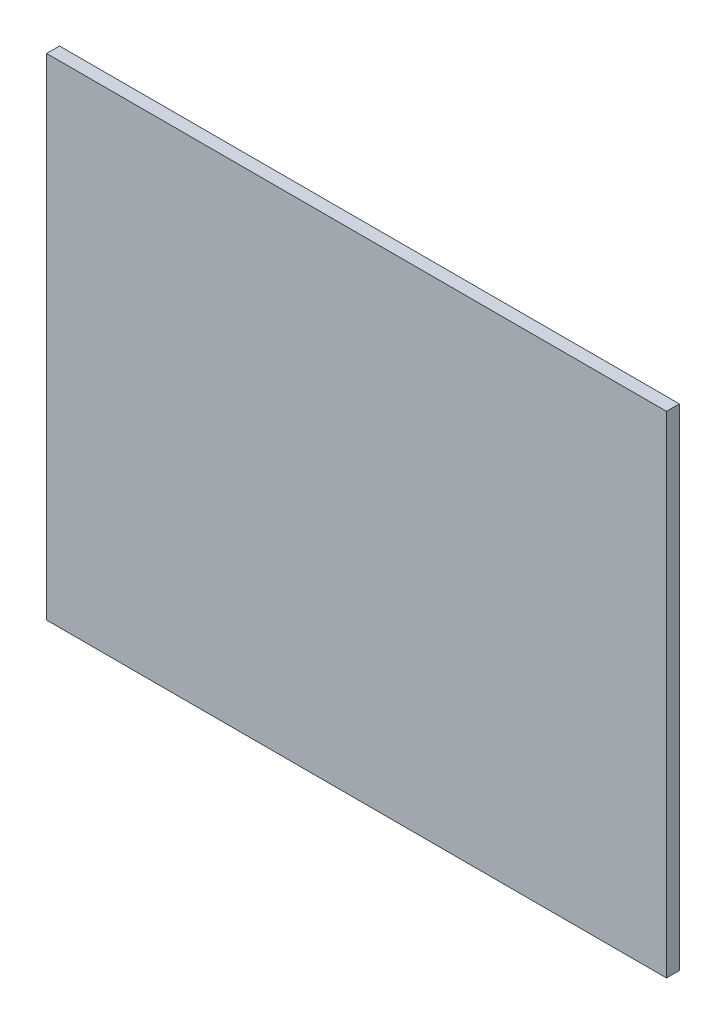
ISO-10303-21;
HEADER;
FILE_DESCRIPTION(('STEP AP214'),'2;1');
FILE_NAME('part.step','',(''),(''),'','','');
FILE_SCHEMA(('AUTOMOTIVE_DESIGN { 1 0 10303 214 1 1 1 1 }'));
ENDSEC;
DATA;
#1=APPLICATION_CONTEXT('core data for automotive mechanical design processes');
#2=APPLICATION_PROTOCOL_DEFINITION('international standard','automotive_design',2000,#1);
#3=PRODUCT_CONTEXT('',#1,'mechanical');
#4=PRODUCT('Part','Part','',(#3));
#5=PRODUCT_RELATED_PRODUCT_CATEGORY('part','',(#4));
#6=PRODUCT_DEFINITION_FORMATION('','',#4);
#7=PRODUCT_DEFINITION_CONTEXT('part definition',#1,'design');
#8=PRODUCT_DEFINITION('design','',#6,#7);
#9=PRODUCT_DEFINITION_SHAPE('','',#8);
#10=(LENGTH_UNIT() NAMED_UNIT(*) SI_UNIT(.MILLI.,.METRE.));
#11=(NAMED_UNIT(*) PLANE_ANGLE_UNIT() SI_UNIT($,.RADIAN.));
#12=(NAMED_UNIT(*) SI_UNIT($,.STERADIAN.) SOLID_ANGLE_UNIT());
#13=UNCERTAINTY_MEASURE_WITH_UNIT(LENGTH_MEASURE(1.E-05),#10,'distance_accuracy_value','');
#14=(GEOMETRIC_REPRESENTATION_CONTEXT(3) GLOBAL_UNCERTAINTY_ASSIGNED_CONTEXT((#13)) GLOBAL_UNIT_ASSIGNED_CONTEXT((#10,
#11,#12)) REPRESENTATION_CONTEXT('',''));
#15=CARTESIAN_POINT('',(0.,0.,0.));
#16=DIRECTION('',(0.,0.,1.));
#17=DIRECTION('',(1.,0.,0.));
#18=AXIS2_PLACEMENT_3D('',#15,#16,#17);
#19=CARTESIAN_POINT('',(0.,0.,5.));
#20=DIRECTION('',(1.,0.,0.));
#21=DIRECTION('',(0.,1.,0.));
#22=AXIS2_PLACEMENT_3D('',#19,#20,#21);
#23=PLANE('',#22);
#24=DIRECTION('',(0.,-1.,0.));
#25=VECTOR('',#24,1.);
#26=CARTESIAN_POINT('',(0.,0.,0.));
#27=LINE('',#26,#25);
#28=CARTESIAN_POINT('',(0.,0.,0.));
#29=VERTEX_POINT('',#28);
#30=CARTESIAN_POINT('',(0.,-190.,0.));
#31=VERTEX_POINT('',#30);
#32=EDGE_CURVE('E96',#29,#31,#27,.T.);
#33=ORIENTED_EDGE('',*,*,#32,.T.);
#34=DIRECTION('',(0.,0.,-1.));
#35=VECTOR('',#34,1.);
#36=CARTESIAN_POINT('',(0.,-190.,5.));
#37=LINE('',#36,#35);
#38=CARTESIAN_POINT('',(0.,-190.,5.));
#39=VERTEX_POINT('',#38);
#40=EDGE_CURVE('E11',#39,#31,#37,.T.);
#41=ORIENTED_EDGE('',*,*,#40,.F.);
#42=DIRECTION('',(0.,-1.,0.));
#43=VECTOR('',#42,1.);
#44=CARTESIAN_POINT('',(0.,0.,5.));
#45=LINE('',#44,#43);
#46=CARTESIAN_POINT('',(0.,0.,5.));
#47=VERTEX_POINT('',#46);
#48=EDGE_CURVE('E84',#47,#39,#45,.T.);
#49=ORIENTED_EDGE('',*,*,#48,.F.);
#50=DIRECTION('',(0.,0.,-1.));
#51=VECTOR('',#50,1.);
#52=CARTESIAN_POINT('',(0.,0.,5.));
#53=LINE('',#52,#51);
#54=EDGE_CURVE('E92',#47,#29,#53,.T.);
#55=ORIENTED_EDGE('',*,*,#54,.T.);
#56=EDGE_LOOP('',(#33,#41,#49,#55));
#57=FACE_BOUND('',#56,.T.);
#58=ADVANCED_FACE('F33',(#57),#23,.F.);
#59=CARTESIAN_POINT('',(0.,-190.,5.));
#60=DIRECTION('',(0.,1.,0.));
#61=DIRECTION('',(0.,0.,1.));
#62=AXIS2_PLACEMENT_3D('',#59,#60,#61);
#63=PLANE('',#62);
#64=DIRECTION('',(1.,0.,0.));
#65=VECTOR('',#64,1.);
#66=CARTESIAN_POINT('',(0.,-190.,0.));
#67=LINE('',#66,#65);
#68=CARTESIAN_POINT('',(240.,-190.,0.));
#69=VERTEX_POINT('',#68);
#70=EDGE_CURVE('E88',#31,#69,#67,.T.);
#71=ORIENTED_EDGE('',*,*,#70,.T.);
#72=DIRECTION('',(0.,0.,-1.));
#73=VECTOR('',#72,1.);
#74=CARTESIAN_POINT('',(240.,-190.,5.));
#75=LINE('',#74,#73);
#76=CARTESIAN_POINT('',(240.,-190.,5.));
#77=VERTEX_POINT('',#76);
#78=EDGE_CURVE('E41',#77,#69,#75,.T.);
#79=ORIENTED_EDGE('',*,*,#78,.F.);
#80=DIRECTION('',(1.,0.,0.));
#81=VECTOR('',#80,1.);
#82=CARTESIAN_POINT('',(0.,-190.,5.));
#83=LINE('',#82,#81);
#84=EDGE_CURVE('E79',#39,#77,#83,.T.);
#85=ORIENTED_EDGE('',*,*,#84,.F.);
#86=ORIENTED_EDGE('',*,*,#40,.T.);
#87=EDGE_LOOP('',(#71,#79,#85,#86));
#88=FACE_BOUND('',#87,.T.);
#89=ADVANCED_FACE('F87',(#88),#63,.F.);
#90=CARTESIAN_POINT('',(240.,0.,5.));
#91=DIRECTION('',(-1.,0.,0.));
#92=DIRECTION('',(0.,-1.,0.));
#93=AXIS2_PLACEMENT_3D('',#90,#91,#92);
#94=PLANE('',#93);
#95=DIRECTION('',(0.,1.,0.));
#96=VECTOR('',#95,1.);
#97=CARTESIAN_POINT('',(240.,0.,0.));
#98=LINE('',#97,#96);
#99=CARTESIAN_POINT('',(240.,0.,0.));
#100=VERTEX_POINT('',#99);
#101=EDGE_CURVE('E66',#69,#100,#98,.T.);
#102=ORIENTED_EDGE('',*,*,#101,.T.);
#103=DIRECTION('',(0.,0.,-1.));
#104=VECTOR('',#103,1.);
#105=CARTESIAN_POINT('',(240.,0.,5.));
#106=LINE('',#105,#104);
#107=CARTESIAN_POINT('',(240.,0.,5.));
#108=VERTEX_POINT('',#107);
#109=EDGE_CURVE('E89',#108,#100,#106,.T.);
#110=ORIENTED_EDGE('',*,*,#109,.F.);
#111=DIRECTION('',(0.,1.,0.));
#112=VECTOR('',#111,1.);
#113=CARTESIAN_POINT('',(240.,0.,5.));
#114=LINE('',#113,#112);
#115=EDGE_CURVE('E82',#77,#108,#114,.T.);
#116=ORIENTED_EDGE('',*,*,#115,.F.);
#117=ORIENTED_EDGE('',*,*,#78,.T.);
#118=EDGE_LOOP('',(#102,#110,#116,#117));
#119=FACE_BOUND('',#118,.T.);
#120=ADVANCED_FACE('F90',(#119),#94,.F.);
#121=CARTESIAN_POINT('',(0.,0.,5.));
#122=DIRECTION('',(0.,-1.,0.));
#123=DIRECTION('',(0.,0.,-1.));
#124=AXIS2_PLACEMENT_3D('',#121,#122,#123);
#125=PLANE('',#124);
#126=DIRECTION('',(-1.,0.,0.));
#127=VECTOR('',#126,1.);
#128=CARTESIAN_POINT('',(0.,0.,0.));
#129=LINE('',#128,#127);
#130=EDGE_CURVE('E72',#100,#29,#129,.T.);
#131=ORIENTED_EDGE('',*,*,#130,.T.);
#132=ORIENTED_EDGE('',*,*,#54,.F.);
#133=DIRECTION('',(-1.,0.,0.));
#134=VECTOR('',#133,1.);
#135=CARTESIAN_POINT('',(0.,0.,5.));
#136=LINE('',#135,#134);
#137=EDGE_CURVE('E49',#108,#47,#136,.T.);
#138=ORIENTED_EDGE('',*,*,#137,.F.);
#139=ORIENTED_EDGE('',*,*,#109,.T.);
#140=EDGE_LOOP('',(#131,#132,#138,#139));
#141=FACE_BOUND('',#140,.T.);
#142=ADVANCED_FACE('F103',(#141),#125,.F.);
#143=CARTESIAN_POINT('',(0.,0.,5.));
#144=DIRECTION('',(0.,0.,1.));
#145=DIRECTION('',(1.,0.,0.));
#146=AXIS2_PLACEMENT_3D('',#143,#144,#145);
#147=PLANE('',#146);
#148=ORIENTED_EDGE('',*,*,#48,.T.);
#149=ORIENTED_EDGE('',*,*,#84,.T.);
#150=ORIENTED_EDGE('',*,*,#115,.T.);
#151=ORIENTED_EDGE('',*,*,#137,.T.);
#152=EDGE_LOOP('',(#148,#149,#150,#151));
#153=FACE_BOUND('',#152,.T.);
#154=ADVANCED_FACE('F80',(#153),#147,.T.);
#155=CARTESIAN_POINT('',(0.,0.,0.));
#156=DIRECTION('',(0.,0.,1.));
#157=DIRECTION('',(1.,0.,0.));
#158=AXIS2_PLACEMENT_3D('',#155,#156,#157);
#159=PLANE('',#158);
#160=ORIENTED_EDGE('',*,*,#32,.F.);
#161=ORIENTED_EDGE('',*,*,#130,.F.);
#162=ORIENTED_EDGE('',*,*,#101,.F.);
#163=ORIENTED_EDGE('',*,*,#70,.F.);
#164=EDGE_LOOP('',(#160,#161,#162,#163));
#165=FACE_BOUND('',#164,.T.);
#166=ADVANCED_FACE('F106',(#165),#159,.F.);
#167=CLOSED_SHELL('',(#58,#89,#120,#142,#154,#166));
#168=MANIFOLD_SOLID_BREP('B2',#167);
#169=ADVANCED_BREP_SHAPE_REPRESENTATION('',(#18,#168),#14);
#170=SHAPE_DEFINITION_REPRESENTATION(#9,#169);
ENDSEC;
END-ISO-10303-21;
